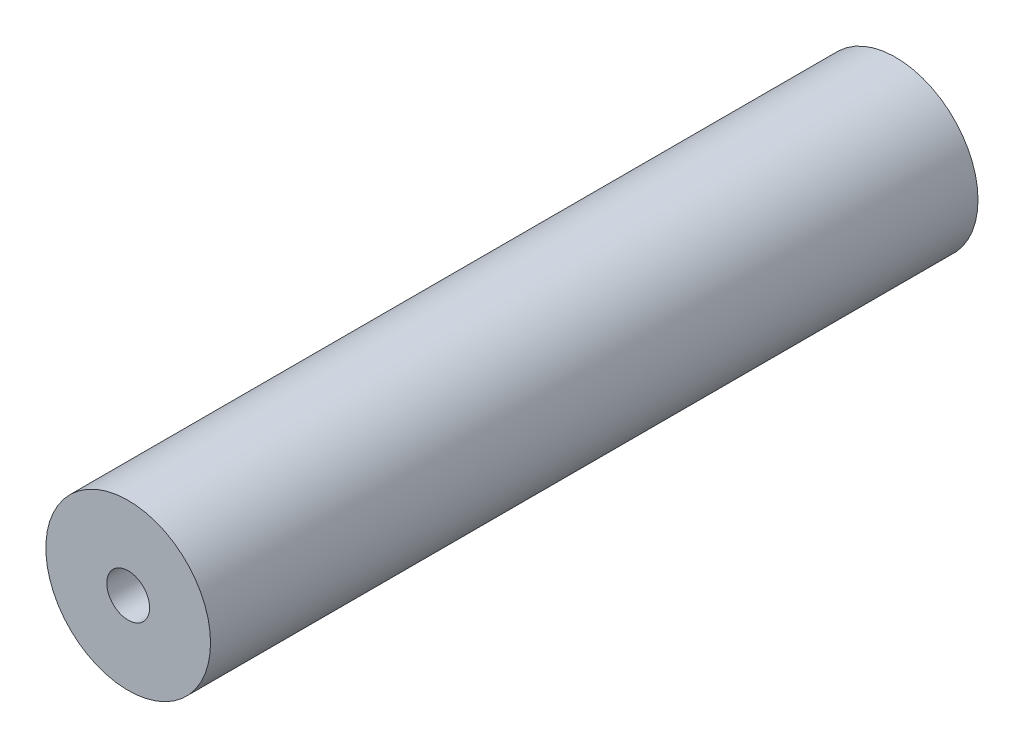
ISO-10303-21;
HEADER;
FILE_DESCRIPTION(('STEP AP214'),'2;1');
FILE_NAME('part.step','',(''),(''),'','','');
FILE_SCHEMA(('AUTOMOTIVE_DESIGN { 1 0 10303 214 1 1 1 1 }'));
ENDSEC;
DATA;
#1=APPLICATION_CONTEXT('core data for automotive mechanical design processes');
#2=APPLICATION_PROTOCOL_DEFINITION('international standard','automotive_design',2000,#1);
#3=PRODUCT_CONTEXT('',#1,'mechanical');
#4=PRODUCT('Part','Part','',(#3));
#5=PRODUCT_RELATED_PRODUCT_CATEGORY('part','',(#4));
#6=PRODUCT_DEFINITION_FORMATION('','',#4);
#7=PRODUCT_DEFINITION_CONTEXT('part definition',#1,'design');
#8=PRODUCT_DEFINITION('design','',#6,#7);
#9=PRODUCT_DEFINITION_SHAPE('','',#8);
#10=(LENGTH_UNIT() NAMED_UNIT(*) SI_UNIT(.MILLI.,.METRE.));
#11=(NAMED_UNIT(*) PLANE_ANGLE_UNIT() SI_UNIT($,.RADIAN.));
#12=(NAMED_UNIT(*) SI_UNIT($,.STERADIAN.) SOLID_ANGLE_UNIT());
#13=UNCERTAINTY_MEASURE_WITH_UNIT(LENGTH_MEASURE(1.E-05),#10,'distance_accuracy_value','');
#14=(GEOMETRIC_REPRESENTATION_CONTEXT(3) GLOBAL_UNCERTAINTY_ASSIGNED_CONTEXT((#13)) GLOBAL_UNIT_ASSIGNED_CONTEXT((#10,
#11,#12)) REPRESENTATION_CONTEXT('',''));
#15=CARTESIAN_POINT('',(0.,0.,0.));
#16=DIRECTION('',(0.,0.,1.));
#17=DIRECTION('',(1.,0.,0.));
#18=AXIS2_PLACEMENT_3D('',#15,#16,#17);
#19=CARTESIAN_POINT('',(0.,0.,46.6));
#20=DIRECTION('',(0.,0.,-1.));
#21=DIRECTION('',(-1.,0.,0.));
#22=AXIS2_PLACEMENT_3D('',#19,#20,#21);
#23=CYLINDRICAL_SURFACE('',#22,5.);
#24=CARTESIAN_POINT('',(0.,0.,46.6));
#25=DIRECTION('',(0.,0.,1.));
#26=DIRECTION('',(1.,0.,0.));
#27=AXIS2_PLACEMENT_3D('',#24,#25,#26);
#28=CIRCLE('',#27,5.);
#29=CARTESIAN_POINT('',(5.,0.,46.6));
#30=VERTEX_POINT('',#29);
#31=EDGE_CURVE('E10',#30,#30,#28,.T.);
#32=ORIENTED_EDGE('',*,*,#31,.F.);
#33=EDGE_LOOP('',(#32));
#34=FACE_BOUND('',#33,.T.);
#35=CARTESIAN_POINT('',(0.,0.,0.));
#36=DIRECTION('',(0.,0.,1.));
#37=DIRECTION('',(1.,0.,0.));
#38=AXIS2_PLACEMENT_3D('',#35,#36,#37);
#39=CIRCLE('',#38,5.);
#40=CARTESIAN_POINT('',(5.,0.,0.));
#41=VERTEX_POINT('',#40);
#42=EDGE_CURVE('E38',#41,#41,#39,.T.);
#43=ORIENTED_EDGE('',*,*,#42,.T.);
#44=EDGE_LOOP('',(#43));
#45=FACE_BOUND('',#44,.T.);
#46=ADVANCED_FACE('F35',(#34,#45),#23,.T.);
#47=CARTESIAN_POINT('',(0.,0.,46.6));
#48=DIRECTION('',(0.,0.,1.));
#49=DIRECTION('',(1.,0.,0.));
#50=AXIS2_PLACEMENT_3D('',#47,#48,#49);
#51=PLANE('',#50);
#52=CARTESIAN_POINT('',(0.,0.,46.6));
#53=DIRECTION('',(0.,0.,1.));
#54=DIRECTION('',(1.,0.,0.));
#55=AXIS2_PLACEMENT_3D('',#52,#53,#54);
#56=CIRCLE('',#55,1.3);
#57=CARTESIAN_POINT('',(1.3,0.,46.6));
#58=VERTEX_POINT('',#57);
#59=EDGE_CURVE('E47',#58,#58,#56,.T.);
#60=ORIENTED_EDGE('',*,*,#59,.F.);
#61=EDGE_LOOP('',(#60));
#62=FACE_BOUND('',#61,.T.);
#63=ORIENTED_EDGE('',*,*,#31,.T.);
#64=EDGE_LOOP('',(#63));
#65=FACE_BOUND('',#64,.T.);
#66=ADVANCED_FACE('F62',(#62,#65),#51,.T.);
#67=CARTESIAN_POINT('',(0.,0.,0.));
#68=DIRECTION('',(0.,0.,1.));
#69=DIRECTION('',(1.,0.,0.));
#70=AXIS2_PLACEMENT_3D('',#67,#68,#69);
#71=PLANE('',#70);
#72=CARTESIAN_POINT('',(0.,0.,0.));
#73=DIRECTION('',(0.,0.,1.));
#74=DIRECTION('',(1.,0.,0.));
#75=AXIS2_PLACEMENT_3D('',#72,#73,#74);
#76=CIRCLE('',#75,1.3);
#77=CARTESIAN_POINT('',(1.3,0.,0.));
#78=VERTEX_POINT('',#77);
#79=EDGE_CURVE('E45',#78,#78,#76,.T.);
#80=ORIENTED_EDGE('',*,*,#79,.T.);
#81=EDGE_LOOP('',(#80));
#82=FACE_BOUND('',#81,.T.);
#83=ORIENTED_EDGE('',*,*,#42,.F.);
#84=EDGE_LOOP('',(#83));
#85=FACE_BOUND('',#84,.T.);
#86=ADVANCED_FACE('F53',(#82,#85),#71,.F.);
#87=CARTESIAN_POINT('',(0.,0.,0.));
#88=DIRECTION('',(0.,0.,1.));
#89=DIRECTION('',(1.,0.,0.));
#90=AXIS2_PLACEMENT_3D('',#87,#88,#89);
#91=CYLINDRICAL_SURFACE('',#90,1.3);
#92=ORIENTED_EDGE('',*,*,#79,.F.);
#93=EDGE_LOOP('',(#92));
#94=FACE_BOUND('',#93,.T.);
#95=ORIENTED_EDGE('',*,*,#59,.T.);
#96=EDGE_LOOP('',(#95));
#97=FACE_BOUND('',#96,.T.);
#98=ADVANCED_FACE('F56',(#94,#97),#91,.F.);
#99=CLOSED_SHELL('',(#46,#66,#86,#98));
#100=MANIFOLD_SOLID_BREP('B2',#99);
#101=ADVANCED_BREP_SHAPE_REPRESENTATION('',(#18,#100),#14);
#102=SHAPE_DEFINITION_REPRESENTATION(#9,#101);
ENDSEC;
END-ISO-10303-21;
